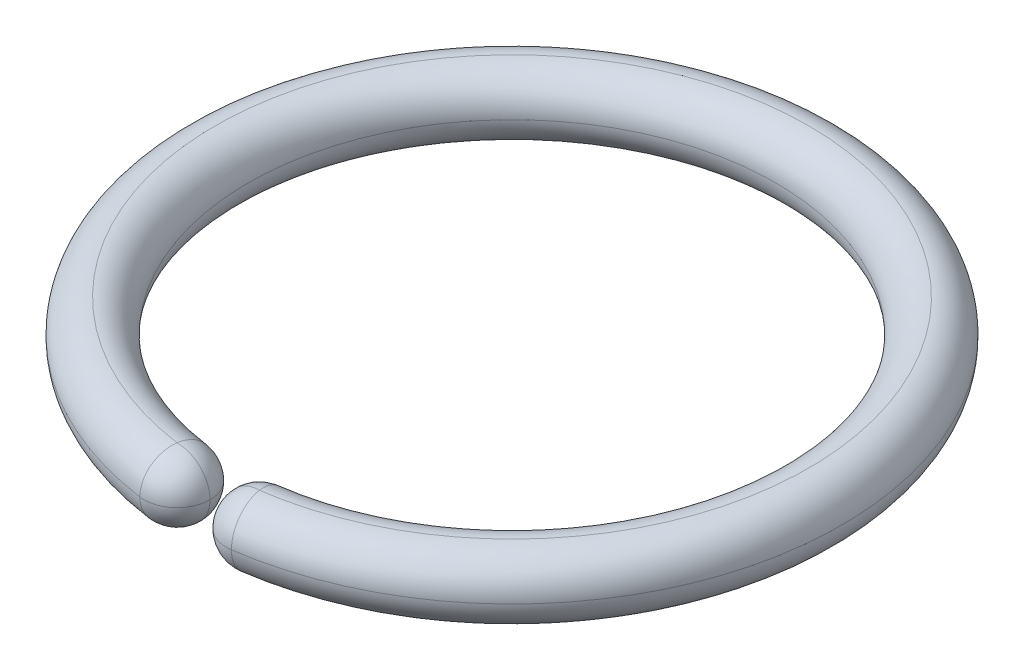
ISO-10303-21;
HEADER;
FILE_DESCRIPTION(('STEP AP214'),'2;1');
FILE_NAME('part.step','',(''),(''),'','','');
FILE_SCHEMA(('AUTOMOTIVE_DESIGN { 1 0 10303 214 1 1 1 1 }'));
ENDSEC;
DATA;
#1=APPLICATION_CONTEXT('core data for automotive mechanical design processes');
#2=APPLICATION_PROTOCOL_DEFINITION('international standard','automotive_design',2000,#1);
#3=PRODUCT_CONTEXT('',#1,'mechanical');
#4=PRODUCT('Part','Part','',(#3));
#5=PRODUCT_RELATED_PRODUCT_CATEGORY('part','',(#4));
#6=PRODUCT_DEFINITION_FORMATION('','',#4);
#7=PRODUCT_DEFINITION_CONTEXT('part definition',#1,'design');
#8=PRODUCT_DEFINITION('design','',#6,#7);
#9=PRODUCT_DEFINITION_SHAPE('','',#8);
#10=(LENGTH_UNIT() NAMED_UNIT(*) SI_UNIT(.MILLI.,.METRE.));
#11=(NAMED_UNIT(*) PLANE_ANGLE_UNIT() SI_UNIT($,.RADIAN.));
#12=(NAMED_UNIT(*) SI_UNIT($,.STERADIAN.) SOLID_ANGLE_UNIT());
#13=UNCERTAINTY_MEASURE_WITH_UNIT(LENGTH_MEASURE(1.E-05),#10,'distance_accuracy_value','');
#14=(GEOMETRIC_REPRESENTATION_CONTEXT(3) GLOBAL_UNCERTAINTY_ASSIGNED_CONTEXT((#13)) GLOBAL_UNIT_ASSIGNED_CONTEXT((#10,
#11,#12)) REPRESENTATION_CONTEXT('',''));
#15=CARTESIAN_POINT('',(0.,0.,0.));
#16=DIRECTION('',(0.,0.,1.));
#17=DIRECTION('',(1.,0.,0.));
#18=AXIS2_PLACEMENT_3D('',#15,#16,#17);
#19=CARTESIAN_POINT('',(-144.133066875093,0.5,-185.262380705993));
#20=DIRECTION('',(0.,1.,0.));
#21=DIRECTION('',(0.,0.,1.));
#22=AXIS2_PLACEMENT_3D('',#19,#20,#21);
#23=TOROIDAL_SURFACE('',#22,4.49999999999999,0.5);
#24=CARTESIAN_POINT('',(-144.133066875093,0.5,-185.262380705993));
#25=DIRECTION('',(0.,1.,0.));
#26=DIRECTION('',(0.,0.,1.));
#27=AXIS2_PLACEMENT_3D('',#24,#25,#26);
#28=CIRCLE('',#27,4.99999999999999);
#29=CARTESIAN_POINT('',(-144.827511319537,0.5,-180.310840853222));
#30=VERTEX_POINT('',#29);
#31=CARTESIAN_POINT('',(-143.438622430648,0.5,-180.310840853222));
#32=VERTEX_POINT('',#31);
#33=EDGE_CURVE('E132',#30,#32,#28,.F.);
#34=ORIENTED_EDGE('',*,*,#33,.F.);
#35=CARTESIAN_POINT('',(-144.758066875093,0.5,-180.805994838499));
#36=DIRECTION('',(0.990307970554215,0.,0.138888888888892));
#37=DIRECTION('',(0.138888888888892,0.,-0.990307970554216));
#38=AXIS2_PLACEMENT_3D('',#35,#36,#37);
#39=CIRCLE('',#38,0.5);
#40=CARTESIAN_POINT('',(-144.758066875093,1.,-180.8059948385));
#41=VERTEX_POINT('',#40);
#42=EDGE_CURVE('E11',#30,#41,#39,.F.);
#43=ORIENTED_EDGE('',*,*,#42,.T.);
#44=CARTESIAN_POINT('',(-144.133066875093,1.,-185.262380705993));
#45=DIRECTION('',(0.,1.,0.));
#46=DIRECTION('',(0.,0.,1.));
#47=AXIS2_PLACEMENT_3D('',#44,#45,#46);
#48=CIRCLE('',#47,4.49999999999999);
#49=CARTESIAN_POINT('',(-143.508066875093,1.,-180.805994838499));
#50=VERTEX_POINT('',#49);
#51=EDGE_CURVE('E129',#50,#41,#48,.T.);
#52=ORIENTED_EDGE('',*,*,#51,.F.);
#53=CARTESIAN_POINT('',(-143.508066875093,0.5,-180.805994838499));
#54=DIRECTION('',(0.990307970554216,0.,-0.138888888888886));
#55=DIRECTION('',(-0.138888888888886,0.,-0.990307970554216));
#56=AXIS2_PLACEMENT_3D('',#53,#54,#55);
#57=CIRCLE('',#56,0.5);
#58=EDGE_CURVE('E51',#50,#32,#57,.T.);
#59=ORIENTED_EDGE('',*,*,#58,.T.);
#60=EDGE_LOOP('',(#34,#43,#52,#59));
#61=FACE_BOUND('',#60,.T.);
#62=ADVANCED_FACE('F41',(#61),#23,.T.);
#63=CARTESIAN_POINT('',(-144.133066875093,0.5,-185.262380705993));
#64=DIRECTION('',(0.,1.,0.));
#65=DIRECTION('',(0.,0.,1.));
#66=AXIS2_PLACEMENT_3D('',#63,#64,#65);
#67=TOROIDAL_SURFACE('',#66,4.49999999999999,0.5);
#68=ORIENTED_EDGE('',*,*,#51,.T.);
#69=CARTESIAN_POINT('',(-144.758066875093,0.5,-180.805994838499));
#70=DIRECTION('',(0.990307970554215,0.,0.138888888888892));
#71=DIRECTION('',(0.138888888888892,0.,-0.990307970554216));
#72=AXIS2_PLACEMENT_3D('',#69,#70,#71);
#73=CIRCLE('',#72,0.5);
#74=CARTESIAN_POINT('',(-144.688622430648,0.5,-181.301148823777));
#75=VERTEX_POINT('',#74);
#76=EDGE_CURVE('E125',#41,#75,#73,.F.);
#77=ORIENTED_EDGE('',*,*,#76,.T.);
#78=CARTESIAN_POINT('',(-144.133066875093,0.5,-185.262380705993));
#79=DIRECTION('',(0.,1.,0.));
#80=DIRECTION('',(0.,0.,1.));
#81=AXIS2_PLACEMENT_3D('',#78,#79,#80);
#82=CIRCLE('',#81,3.99999999999999);
#83=CARTESIAN_POINT('',(-143.577511319537,0.5,-181.301148823777));
#84=VERTEX_POINT('',#83);
#85=EDGE_CURVE('E134',#84,#75,#82,.T.);
#86=ORIENTED_EDGE('',*,*,#85,.F.);
#87=CARTESIAN_POINT('',(-143.508066875093,0.5,-180.805994838499));
#88=DIRECTION('',(0.990307970554216,0.,-0.138888888888886));
#89=DIRECTION('',(-0.138888888888886,0.,-0.990307970554216));
#90=AXIS2_PLACEMENT_3D('',#87,#88,#89);
#91=CIRCLE('',#90,0.5);
#92=EDGE_CURVE('E86',#84,#50,#91,.T.);
#93=ORIENTED_EDGE('',*,*,#92,.T.);
#94=EDGE_LOOP('',(#68,#77,#86,#93));
#95=FACE_BOUND('',#94,.T.);
#96=ADVANCED_FACE('F163',(#95),#67,.T.);
#97=CARTESIAN_POINT('',(-144.133066875093,0.5,-185.262380705993));
#98=DIRECTION('',(0.,1.,0.));
#99=DIRECTION('',(0.,0.,1.));
#100=AXIS2_PLACEMENT_3D('',#97,#98,#99);
#101=TOROIDAL_SURFACE('',#100,4.49999999999999,0.5);
#102=CARTESIAN_POINT('',(-144.133066875093,0.,-185.262380705993));
#103=DIRECTION('',(0.,1.,0.));
#104=DIRECTION('',(0.,0.,1.));
#105=AXIS2_PLACEMENT_3D('',#102,#103,#104);
#106=CIRCLE('',#105,4.49999999999999);
#107=CARTESIAN_POINT('',(-144.758066875093,0.,-180.8059948385));
#108=VERTEX_POINT('',#107);
#109=CARTESIAN_POINT('',(-143.508066875093,0.,-180.805994838499));
#110=VERTEX_POINT('',#109);
#111=EDGE_CURVE('E109',#108,#110,#106,.F.);
#112=ORIENTED_EDGE('',*,*,#111,.F.);
#113=CARTESIAN_POINT('',(-144.758066875093,0.5,-180.805994838499));
#114=DIRECTION('',(0.990307970554215,0.,0.138888888888892));
#115=DIRECTION('',(0.138888888888892,0.,-0.990307970554216));
#116=AXIS2_PLACEMENT_3D('',#113,#114,#115);
#117=CIRCLE('',#116,0.5);
#118=EDGE_CURVE('E118',#108,#30,#117,.F.);
#119=ORIENTED_EDGE('',*,*,#118,.T.);
#120=ORIENTED_EDGE('',*,*,#33,.T.);
#121=CARTESIAN_POINT('',(-143.508066875093,0.5,-180.805994838499));
#122=DIRECTION('',(0.990307970554216,0.,-0.138888888888886));
#123=DIRECTION('',(-0.138888888888886,0.,-0.990307970554216));
#124=AXIS2_PLACEMENT_3D('',#121,#122,#123);
#125=CIRCLE('',#124,0.5);
#126=EDGE_CURVE('E105',#32,#110,#125,.T.);
#127=ORIENTED_EDGE('',*,*,#126,.T.);
#128=EDGE_LOOP('',(#112,#119,#120,#127));
#129=FACE_BOUND('',#128,.T.);
#130=ADVANCED_FACE('F145',(#129),#101,.T.);
#131=CARTESIAN_POINT('',(-144.133066875093,0.5,-185.262380705993));
#132=DIRECTION('',(0.,1.,0.));
#133=DIRECTION('',(0.,0.,1.));
#134=AXIS2_PLACEMENT_3D('',#131,#132,#133);
#135=TOROIDAL_SURFACE('',#134,4.49999999999999,0.5);
#136=ORIENTED_EDGE('',*,*,#85,.T.);
#137=CARTESIAN_POINT('',(-144.758066875093,0.5,-180.805994838499));
#138=DIRECTION('',(0.990307970554215,0.,0.138888888888892));
#139=DIRECTION('',(0.138888888888892,0.,-0.990307970554216));
#140=AXIS2_PLACEMENT_3D('',#137,#138,#139);
#141=CIRCLE('',#140,0.5);
#142=EDGE_CURVE('E121',#75,#108,#141,.F.);
#143=ORIENTED_EDGE('',*,*,#142,.T.);
#144=ORIENTED_EDGE('',*,*,#111,.T.);
#145=CARTESIAN_POINT('',(-143.508066875093,0.5,-180.805994838499));
#146=DIRECTION('',(0.990307970554216,0.,-0.138888888888886));
#147=DIRECTION('',(-0.138888888888886,0.,-0.990307970554216));
#148=AXIS2_PLACEMENT_3D('',#145,#146,#147);
#149=CIRCLE('',#148,0.5);
#150=EDGE_CURVE('E99',#110,#84,#149,.T.);
#151=ORIENTED_EDGE('',*,*,#150,.T.);
#152=EDGE_LOOP('',(#136,#143,#144,#151));
#153=FACE_BOUND('',#152,.T.);
#154=ADVANCED_FACE('F140',(#153),#135,.T.);
#155=CARTESIAN_POINT('',(-144.758066875093,0.5,-180.805994838499));
#156=DIRECTION('',(-1.,0.,0.));
#157=DIRECTION('',(0.,0.,1.));
#158=AXIS2_PLACEMENT_3D('',#155,#156,#157);
#159=SPHERICAL_SURFACE('',#158,0.5);
#160=CARTESIAN_POINT('',(-144.758066875093,0.5,-180.805994838499));
#161=DIRECTION('',(0.,1.,0.));
#162=DIRECTION('',(0.,0.,1.));
#163=AXIS2_PLACEMENT_3D('',#160,#161,#162);
#164=CIRCLE('',#163,0.5);
#165=CARTESIAN_POINT('',(-144.258066875093,0.5,-180.805994838499));
#166=VERTEX_POINT('',#165);
#167=EDGE_CURVE('E110',#30,#166,#164,.T.);
#168=ORIENTED_EDGE('',*,*,#167,.F.);
#169=ORIENTED_EDGE('',*,*,#118,.F.);
#170=CARTESIAN_POINT('',(-144.758066875093,0.5,-180.805994838499));
#171=DIRECTION('',(0.,0.,-1.));
#172=DIRECTION('',(-1.,0.,0.));
#173=AXIS2_PLACEMENT_3D('',#170,#171,#172);
#174=CIRCLE('',#173,0.5);
#175=EDGE_CURVE('E72',#166,#108,#174,.T.);
#176=ORIENTED_EDGE('',*,*,#175,.F.);
#177=EDGE_LOOP('',(#168,#169,#176));
#178=FACE_BOUND('',#177,.T.);
#179=ADVANCED_FACE('F148',(#178),#159,.T.);
#180=CARTESIAN_POINT('',(-144.758066875093,0.5,-180.805994838499));
#181=DIRECTION('',(-1.,0.,0.));
#182=DIRECTION('',(0.,0.,1.));
#183=AXIS2_PLACEMENT_3D('',#180,#181,#182);
#184=SPHERICAL_SURFACE('',#183,0.5);
#185=ORIENTED_EDGE('',*,*,#175,.T.);
#186=ORIENTED_EDGE('',*,*,#142,.F.);
#187=CARTESIAN_POINT('',(-144.758066875093,0.5,-180.805994838499));
#188=DIRECTION('',(0.,1.,0.));
#189=DIRECTION('',(0.,0.,1.));
#190=AXIS2_PLACEMENT_3D('',#187,#188,#189);
#191=CIRCLE('',#190,0.5);
#192=EDGE_CURVE('E112',#166,#75,#191,.T.);
#193=ORIENTED_EDGE('',*,*,#192,.F.);
#194=EDGE_LOOP('',(#185,#186,#193));
#195=FACE_BOUND('',#194,.T.);
#196=ADVANCED_FACE('F152',(#195),#184,.T.);
#197=CARTESIAN_POINT('',(-144.758066875093,0.5,-180.805994838499));
#198=DIRECTION('',(-1.,0.,0.));
#199=DIRECTION('',(0.,0.,1.));
#200=AXIS2_PLACEMENT_3D('',#197,#198,#199);
#201=SPHERICAL_SURFACE('',#200,0.5);
#202=ORIENTED_EDGE('',*,*,#42,.F.);
#203=ORIENTED_EDGE('',*,*,#167,.T.);
#204=CARTESIAN_POINT('',(-144.758066875093,0.5,-180.805994838499));
#205=DIRECTION('',(0.,0.,-1.));
#206=DIRECTION('',(-1.,0.,0.));
#207=AXIS2_PLACEMENT_3D('',#204,#205,#206);
#208=CIRCLE('',#207,0.5);
#209=EDGE_CURVE('E90',#41,#166,#208,.T.);
#210=ORIENTED_EDGE('',*,*,#209,.F.);
#211=EDGE_LOOP('',(#202,#203,#210));
#212=FACE_BOUND('',#211,.T.);
#213=ADVANCED_FACE('F158',(#212),#201,.T.);
#214=CARTESIAN_POINT('',(-144.758066875093,0.5,-180.805994838499));
#215=DIRECTION('',(-1.,0.,0.));
#216=DIRECTION('',(0.,0.,1.));
#217=AXIS2_PLACEMENT_3D('',#214,#215,#216);
#218=SPHERICAL_SURFACE('',#217,0.5);
#219=ORIENTED_EDGE('',*,*,#192,.T.);
#220=ORIENTED_EDGE('',*,*,#76,.F.);
#221=ORIENTED_EDGE('',*,*,#209,.T.);
#222=EDGE_LOOP('',(#219,#220,#221));
#223=FACE_BOUND('',#222,.T.);
#224=ADVANCED_FACE('F156',(#223),#218,.T.);
#225=CARTESIAN_POINT('',(-143.508066875093,0.5,-180.805994838499));
#226=DIRECTION('',(1.,0.,0.));
#227=DIRECTION('',(0.,0.,-1.));
#228=AXIS2_PLACEMENT_3D('',#225,#226,#227);
#229=SPHERICAL_SURFACE('',#228,0.5);
#230=CARTESIAN_POINT('',(-143.508066875093,0.5,-180.805994838499));
#231=DIRECTION('',(0.,0.,1.));
#232=DIRECTION('',(0.,-1.,0.));
#233=AXIS2_PLACEMENT_3D('',#230,#231,#232);
#234=CIRCLE('',#233,0.5);
#235=CARTESIAN_POINT('',(-144.008066875093,0.5,-180.805994838499));
#236=VERTEX_POINT('',#235);
#237=EDGE_CURVE('E84',#50,#236,#234,.T.);
#238=ORIENTED_EDGE('',*,*,#237,.F.);
#239=ORIENTED_EDGE('',*,*,#92,.F.);
#240=CARTESIAN_POINT('',(-143.508066875093,0.5,-180.805994838499));
#241=DIRECTION('',(0.,-1.,0.));
#242=DIRECTION('',(0.,0.,-1.));
#243=AXIS2_PLACEMENT_3D('',#240,#241,#242);
#244=CIRCLE('',#243,0.5);
#245=EDGE_CURVE('E45',#236,#84,#244,.T.);
#246=ORIENTED_EDGE('',*,*,#245,.F.);
#247=EDGE_LOOP('',(#238,#239,#246));
#248=FACE_BOUND('',#247,.T.);
#249=ADVANCED_FACE('F43',(#248),#229,.T.);
#250=CARTESIAN_POINT('',(-143.508066875093,0.5,-180.805994838499));
#251=DIRECTION('',(1.,0.,0.));
#252=DIRECTION('',(0.,0.,-1.));
#253=AXIS2_PLACEMENT_3D('',#250,#251,#252);
#254=SPHERICAL_SURFACE('',#253,0.5);
#255=ORIENTED_EDGE('',*,*,#245,.T.);
#256=ORIENTED_EDGE('',*,*,#150,.F.);
#257=CARTESIAN_POINT('',(-143.508066875093,0.5,-180.805994838499));
#258=DIRECTION('',(0.,0.,1.));
#259=DIRECTION('',(0.,-1.,0.));
#260=AXIS2_PLACEMENT_3D('',#257,#258,#259);
#261=CIRCLE('',#260,0.5);
#262=EDGE_CURVE('E96',#236,#110,#261,.T.);
#263=ORIENTED_EDGE('',*,*,#262,.F.);
#264=EDGE_LOOP('',(#255,#256,#263));
#265=FACE_BOUND('',#264,.T.);
#266=ADVANCED_FACE('F98',(#265),#254,.T.);
#267=CARTESIAN_POINT('',(-143.508066875093,0.5,-180.805994838499));
#268=DIRECTION('',(1.,0.,0.));
#269=DIRECTION('',(0.,0.,-1.));
#270=AXIS2_PLACEMENT_3D('',#267,#268,#269);
#271=SPHERICAL_SURFACE('',#270,0.5);
#272=ORIENTED_EDGE('',*,*,#58,.F.);
#273=ORIENTED_EDGE('',*,*,#237,.T.);
#274=CARTESIAN_POINT('',(-143.508066875093,0.5,-180.805994838499));
#275=DIRECTION('',(0.,-1.,0.));
#276=DIRECTION('',(0.,0.,-1.));
#277=AXIS2_PLACEMENT_3D('',#274,#275,#276);
#278=CIRCLE('',#277,0.5);
#279=EDGE_CURVE('E95',#32,#236,#278,.T.);
#280=ORIENTED_EDGE('',*,*,#279,.F.);
#281=EDGE_LOOP('',(#272,#273,#280));
#282=FACE_BOUND('',#281,.T.);
#283=ADVANCED_FACE('F93',(#282),#271,.T.);
#284=CARTESIAN_POINT('',(-143.508066875093,0.5,-180.805994838499));
#285=DIRECTION('',(1.,0.,0.));
#286=DIRECTION('',(0.,0.,-1.));
#287=AXIS2_PLACEMENT_3D('',#284,#285,#286);
#288=SPHERICAL_SURFACE('',#287,0.5);
#289=ORIENTED_EDGE('',*,*,#262,.T.);
#290=ORIENTED_EDGE('',*,*,#126,.F.);
#291=ORIENTED_EDGE('',*,*,#279,.T.);
#292=EDGE_LOOP('',(#289,#290,#291));
#293=FACE_BOUND('',#292,.T.);
#294=ADVANCED_FACE('F104',(#293),#288,.T.);
#295=CLOSED_SHELL('',(#62,#96,#130,#154,#179,#196,#213,#224,#249,#266,#283,#294));
#296=MANIFOLD_SOLID_BREP('B2',#295);
#297=ADVANCED_BREP_SHAPE_REPRESENTATION('',(#18,#296),#14);
#298=SHAPE_DEFINITION_REPRESENTATION(#9,#297);
ENDSEC;
END-ISO-10303-21;
